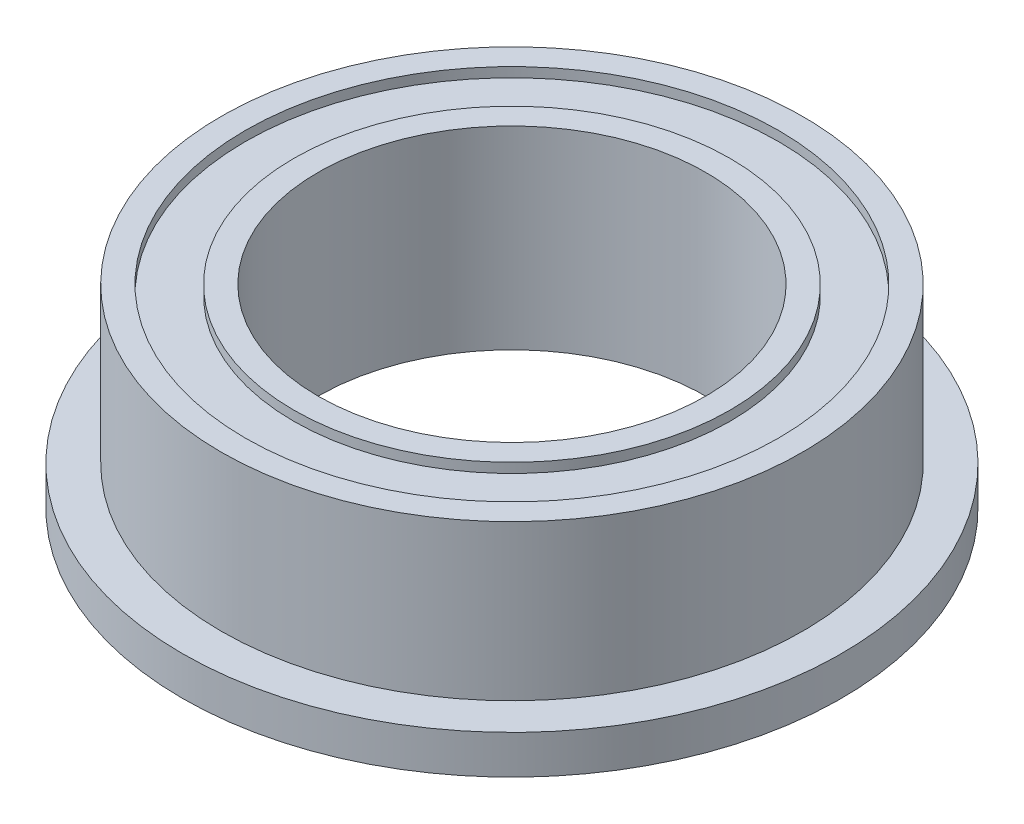
ISO-10303-21;
HEADER;
FILE_DESCRIPTION(('STEP AP214'),'2;1');
FILE_NAME('part.step','',(''),(''),'','','');
FILE_SCHEMA(('AUTOMOTIVE_DESIGN { 1 0 10303 214 1 1 1 1 }'));
ENDSEC;
DATA;
#1=APPLICATION_CONTEXT('core data for automotive mechanical design processes');
#2=APPLICATION_PROTOCOL_DEFINITION('international standard','automotive_design',2000,#1);
#3=PRODUCT_CONTEXT('',#1,'mechanical');
#4=PRODUCT('Part','Part','',(#3));
#5=PRODUCT_RELATED_PRODUCT_CATEGORY('part','',(#4));
#6=PRODUCT_DEFINITION_FORMATION('','',#4);
#7=PRODUCT_DEFINITION_CONTEXT('part definition',#1,'design');
#8=PRODUCT_DEFINITION('design','',#6,#7);
#9=PRODUCT_DEFINITION_SHAPE('','',#8);
#10=(LENGTH_UNIT() NAMED_UNIT(*) SI_UNIT(.MILLI.,.METRE.));
#11=(NAMED_UNIT(*) PLANE_ANGLE_UNIT() SI_UNIT($,.RADIAN.));
#12=(NAMED_UNIT(*) SI_UNIT($,.STERADIAN.) SOLID_ANGLE_UNIT());
#13=UNCERTAINTY_MEASURE_WITH_UNIT(LENGTH_MEASURE(1.E-05),#10,'distance_accuracy_value','');
#14=(GEOMETRIC_REPRESENTATION_CONTEXT(3) GLOBAL_UNCERTAINTY_ASSIGNED_CONTEXT((#13)) GLOBAL_UNIT_ASSIGNED_CONTEXT((#10,
#11,#12)) REPRESENTATION_CONTEXT('',''));
#15=CARTESIAN_POINT('',(0.,0.,0.));
#16=DIRECTION('',(0.,0.,1.));
#17=DIRECTION('',(1.,0.,0.));
#18=AXIS2_PLACEMENT_3D('',#15,#16,#17);
#19=CARTESIAN_POINT('',(0.,0.,0.));
#20=DIRECTION('',(0.,1.,0.));
#21=DIRECTION('',(0.,0.,1.));
#22=AXIS2_PLACEMENT_3D('',#19,#20,#21);
#23=PLANE('',#22);
#24=CARTESIAN_POINT('',(0.,0.,0.));
#25=DIRECTION('',(0.,1.,0.));
#26=DIRECTION('',(0.,0.,1.));
#27=AXIS2_PLACEMENT_3D('',#24,#25,#26);
#28=CIRCLE('',#27,4.);
#29=CARTESIAN_POINT('',(0.,0.,4.));
#30=VERTEX_POINT('',#29);
#31=EDGE_CURVE('E52',#30,#30,#28,.T.);
#32=ORIENTED_EDGE('',*,*,#31,.T.);
#33=EDGE_LOOP('',(#32));
#34=FACE_BOUND('',#33,.T.);
#35=CARTESIAN_POINT('',(0.,0.,0.));
#36=DIRECTION('',(0.,1.,0.));
#37=DIRECTION('',(0.,0.,1.));
#38=AXIS2_PLACEMENT_3D('',#35,#36,#37);
#39=CIRCLE('',#38,4.5);
#40=CARTESIAN_POINT('',(0.,0.,4.5));
#41=VERTEX_POINT('',#40);
#42=EDGE_CURVE('E86',#41,#41,#39,.T.);
#43=ORIENTED_EDGE('',*,*,#42,.F.);
#44=EDGE_LOOP('',(#43));
#45=FACE_BOUND('',#44,.T.);
#46=ADVANCED_FACE('F41',(#34,#45),#23,.F.);
#47=CARTESIAN_POINT('',(0.,4.,0.));
#48=DIRECTION('',(0.,1.,0.));
#49=DIRECTION('',(0.,0.,1.));
#50=AXIS2_PLACEMENT_3D('',#47,#48,#49);
#51=PLANE('',#50);
#52=CARTESIAN_POINT('',(0.,4.,0.));
#53=DIRECTION('',(0.,1.,0.));
#54=DIRECTION('',(0.,0.,1.));
#55=AXIS2_PLACEMENT_3D('',#52,#53,#54);
#56=CIRCLE('',#55,4.);
#57=CARTESIAN_POINT('',(0.,4.,4.));
#58=VERTEX_POINT('',#57);
#59=EDGE_CURVE('E48',#58,#58,#56,.T.);
#60=ORIENTED_EDGE('',*,*,#59,.F.);
#61=EDGE_LOOP('',(#60));
#62=FACE_BOUND('',#61,.T.);
#63=CARTESIAN_POINT('',(0.,4.,0.));
#64=DIRECTION('',(0.,1.,0.));
#65=DIRECTION('',(0.,0.,1.));
#66=AXIS2_PLACEMENT_3D('',#63,#64,#65);
#67=CIRCLE('',#66,4.5);
#68=CARTESIAN_POINT('',(0.,4.,4.5));
#69=VERTEX_POINT('',#68);
#70=EDGE_CURVE('E74',#69,#69,#67,.T.);
#71=ORIENTED_EDGE('',*,*,#70,.T.);
#72=EDGE_LOOP('',(#71));
#73=FACE_BOUND('',#72,.T.);
#74=ADVANCED_FACE('F102',(#62,#73),#51,.T.);
#75=CARTESIAN_POINT('',(0.,4.,0.));
#76=DIRECTION('',(0.,1.,0.));
#77=DIRECTION('',(0.,0.,1.));
#78=AXIS2_PLACEMENT_3D('',#75,#76,#77);
#79=CIRCLE('',#78,5.5);
#80=CARTESIAN_POINT('',(0.,4.,5.5));
#81=VERTEX_POINT('',#80);
#82=EDGE_CURVE('E68',#81,#81,#79,.T.);
#83=ORIENTED_EDGE('',*,*,#82,.F.);
#84=EDGE_LOOP('',(#83));
#85=FACE_BOUND('',#84,.T.);
#86=CARTESIAN_POINT('',(0.,4.,0.));
#87=DIRECTION('',(0.,1.,0.));
#88=DIRECTION('',(0.,0.,1.));
#89=AXIS2_PLACEMENT_3D('',#86,#87,#88);
#90=CIRCLE('',#89,6.);
#91=CARTESIAN_POINT('',(0.,4.,6.));
#92=VERTEX_POINT('',#91);
#93=EDGE_CURVE('E10',#92,#92,#90,.T.);
#94=ORIENTED_EDGE('',*,*,#93,.T.);
#95=EDGE_LOOP('',(#94));
#96=FACE_BOUND('',#95,.T.);
#97=ADVANCED_FACE('F110',(#85,#96),#51,.T.);
#98=CARTESIAN_POINT('',(0.,0.,0.));
#99=DIRECTION('',(0.,1.,0.));
#100=DIRECTION('',(0.,0.,1.));
#101=AXIS2_PLACEMENT_3D('',#98,#99,#100);
#102=CIRCLE('',#101,5.5);
#103=CARTESIAN_POINT('',(0.,0.,5.5));
#104=VERTEX_POINT('',#103);
#105=EDGE_CURVE('E80',#104,#104,#102,.T.);
#106=ORIENTED_EDGE('',*,*,#105,.T.);
#107=EDGE_LOOP('',(#106));
#108=FACE_BOUND('',#107,.T.);
#109=CARTESIAN_POINT('',(0.,0.,0.));
#110=DIRECTION('',(0.,1.,0.));
#111=DIRECTION('',(0.,0.,1.));
#112=AXIS2_PLACEMENT_3D('',#109,#110,#111);
#113=CIRCLE('',#112,6.8);
#114=CARTESIAN_POINT('',(0.,0.,6.8));
#115=VERTEX_POINT('',#114);
#116=EDGE_CURVE('E59',#115,#115,#113,.T.);
#117=ORIENTED_EDGE('',*,*,#116,.F.);
#118=EDGE_LOOP('',(#117));
#119=FACE_BOUND('',#118,.T.);
#120=ADVANCED_FACE('F104',(#108,#119),#23,.F.);
#121=CARTESIAN_POINT('',(0.,4.,0.));
#122=DIRECTION('',(0.,-1.,0.));
#123=DIRECTION('',(0.,0.,-1.));
#124=AXIS2_PLACEMENT_3D('',#121,#122,#123);
#125=CYLINDRICAL_SURFACE('',#124,6.);
#126=CARTESIAN_POINT('',(0.,0.8,0.));
#127=DIRECTION('',(0.,1.,0.));
#128=DIRECTION('',(0.,0.,1.));
#129=AXIS2_PLACEMENT_3D('',#126,#127,#128);
#130=CIRCLE('',#129,6.);
#131=CARTESIAN_POINT('',(0.,0.8,6.));
#132=VERTEX_POINT('',#131);
#133=EDGE_CURVE('E62',#132,#132,#130,.T.);
#134=ORIENTED_EDGE('',*,*,#133,.T.);
#135=EDGE_LOOP('',(#134));
#136=FACE_BOUND('',#135,.T.);
#137=ORIENTED_EDGE('',*,*,#93,.F.);
#138=EDGE_LOOP('',(#137));
#139=FACE_BOUND('',#138,.T.);
#140=ADVANCED_FACE('F43',(#136,#139),#125,.T.);
#141=CARTESIAN_POINT('',(0.,4.,0.));
#142=DIRECTION('',(0.,-1.,0.));
#143=DIRECTION('',(0.,0.,-1.));
#144=AXIS2_PLACEMENT_3D('',#141,#142,#143);
#145=CYLINDRICAL_SURFACE('',#144,4.);
#146=ORIENTED_EDGE('',*,*,#59,.T.);
#147=EDGE_LOOP('',(#146));
#148=FACE_BOUND('',#147,.T.);
#149=ORIENTED_EDGE('',*,*,#31,.F.);
#150=EDGE_LOOP('',(#149));
#151=FACE_BOUND('',#150,.T.);
#152=ADVANCED_FACE('F118',(#148,#151),#145,.F.);
#153=CARTESIAN_POINT('',(0.,0.8,0.));
#154=DIRECTION('',(0.,1.,0.));
#155=DIRECTION('',(0.,0.,1.));
#156=AXIS2_PLACEMENT_3D('',#153,#154,#155);
#157=PLANE('',#156);
#158=CARTESIAN_POINT('',(0.,0.8,0.));
#159=DIRECTION('',(0.,1.,0.));
#160=DIRECTION('',(0.,0.,1.));
#161=AXIS2_PLACEMENT_3D('',#158,#159,#160);
#162=CIRCLE('',#161,6.8);
#163=CARTESIAN_POINT('',(0.,0.8,6.8));
#164=VERTEX_POINT('',#163);
#165=EDGE_CURVE('E57',#164,#164,#162,.T.);
#166=ORIENTED_EDGE('',*,*,#165,.T.);
#167=EDGE_LOOP('',(#166));
#168=FACE_BOUND('',#167,.T.);
#169=ORIENTED_EDGE('',*,*,#133,.F.);
#170=EDGE_LOOP('',(#169));
#171=FACE_BOUND('',#170,.T.);
#172=ADVANCED_FACE('F129',(#168,#171),#157,.T.);
#173=CARTESIAN_POINT('',(0.,0.8,0.));
#174=DIRECTION('',(0.,-1.,0.));
#175=DIRECTION('',(0.,0.,-1.));
#176=AXIS2_PLACEMENT_3D('',#173,#174,#175);
#177=CYLINDRICAL_SURFACE('',#176,6.8);
#178=ORIENTED_EDGE('',*,*,#165,.F.);
#179=EDGE_LOOP('',(#178));
#180=FACE_BOUND('',#179,.T.);
#181=ORIENTED_EDGE('',*,*,#116,.T.);
#182=EDGE_LOOP('',(#181));
#183=FACE_BOUND('',#182,.T.);
#184=ADVANCED_FACE('F126',(#180,#183),#177,.T.);
#185=CARTESIAN_POINT('',(0.,3.8,0.));
#186=DIRECTION('',(0.,1.,0.));
#187=DIRECTION('',(0.,0.,1.));
#188=AXIS2_PLACEMENT_3D('',#185,#186,#187);
#189=CYLINDRICAL_SURFACE('',#188,5.5);
#190=CARTESIAN_POINT('',(0.,3.8,0.));
#191=DIRECTION('',(0.,1.,0.));
#192=DIRECTION('',(0.,0.,1.));
#193=AXIS2_PLACEMENT_3D('',#190,#191,#192);
#194=CIRCLE('',#193,5.5);
#195=CARTESIAN_POINT('',(0.,3.8,5.5));
#196=VERTEX_POINT('',#195);
#197=EDGE_CURVE('E67',#196,#196,#194,.T.);
#198=ORIENTED_EDGE('',*,*,#197,.F.);
#199=EDGE_LOOP('',(#198));
#200=FACE_BOUND('',#199,.T.);
#201=ORIENTED_EDGE('',*,*,#82,.T.);
#202=EDGE_LOOP('',(#201));
#203=FACE_BOUND('',#202,.T.);
#204=ADVANCED_FACE('F128',(#200,#203),#189,.F.);
#205=CARTESIAN_POINT('',(0.,3.8,0.));
#206=DIRECTION('',(0.,1.,0.));
#207=DIRECTION('',(0.,0.,1.));
#208=AXIS2_PLACEMENT_3D('',#205,#206,#207);
#209=PLANE('',#208);
#210=CARTESIAN_POINT('',(0.,3.8,0.));
#211=DIRECTION('',(0.,1.,0.));
#212=DIRECTION('',(0.,0.,1.));
#213=AXIS2_PLACEMENT_3D('',#210,#211,#212);
#214=CIRCLE('',#213,4.5);
#215=CARTESIAN_POINT('',(0.,3.8,4.5));
#216=VERTEX_POINT('',#215);
#217=EDGE_CURVE('E71',#216,#216,#214,.T.);
#218=ORIENTED_EDGE('',*,*,#217,.F.);
#219=EDGE_LOOP('',(#218));
#220=FACE_BOUND('',#219,.T.);
#221=ORIENTED_EDGE('',*,*,#197,.T.);
#222=EDGE_LOOP('',(#221));
#223=FACE_BOUND('',#222,.T.);
#224=ADVANCED_FACE('F136',(#220,#223),#209,.T.);
#225=CARTESIAN_POINT('',(0.,3.8,0.));
#226=DIRECTION('',(0.,1.,0.));
#227=DIRECTION('',(0.,0.,1.));
#228=AXIS2_PLACEMENT_3D('',#225,#226,#227);
#229=CYLINDRICAL_SURFACE('',#228,4.5);
#230=ORIENTED_EDGE('',*,*,#217,.T.);
#231=EDGE_LOOP('',(#230));
#232=FACE_BOUND('',#231,.T.);
#233=ORIENTED_EDGE('',*,*,#70,.F.);
#234=EDGE_LOOP('',(#233));
#235=FACE_BOUND('',#234,.T.);
#236=ADVANCED_FACE('F176',(#232,#235),#229,.T.);
#237=CARTESIAN_POINT('',(0.,0.2,0.));
#238=DIRECTION('',(0.,-1.,0.));
#239=DIRECTION('',(0.,0.,1.));
#240=AXIS2_PLACEMENT_3D('',#237,#238,#239);
#241=PLANE('',#240);
#242=CARTESIAN_POINT('',(0.,0.2,0.));
#243=DIRECTION('',(0.,1.,0.));
#244=DIRECTION('',(0.,0.,1.));
#245=AXIS2_PLACEMENT_3D('',#242,#243,#244);
#246=CIRCLE('',#245,5.5);
#247=CARTESIAN_POINT('',(0.,0.2,5.5));
#248=VERTEX_POINT('',#247);
#249=EDGE_CURVE('E77',#248,#248,#246,.T.);
#250=ORIENTED_EDGE('',*,*,#249,.F.);
#251=EDGE_LOOP('',(#250));
#252=FACE_BOUND('',#251,.T.);
#253=CARTESIAN_POINT('',(0.,0.2,0.));
#254=DIRECTION('',(0.,1.,0.));
#255=DIRECTION('',(0.,0.,1.));
#256=AXIS2_PLACEMENT_3D('',#253,#254,#255);
#257=CIRCLE('',#256,4.5);
#258=CARTESIAN_POINT('',(0.,0.2,4.5));
#259=VERTEX_POINT('',#258);
#260=EDGE_CURVE('E83',#259,#259,#257,.T.);
#261=ORIENTED_EDGE('',*,*,#260,.T.);
#262=EDGE_LOOP('',(#261));
#263=FACE_BOUND('',#262,.T.);
#264=ADVANCED_FACE('F92',(#252,#263),#241,.T.);
#265=CARTESIAN_POINT('',(0.,0.2,0.));
#266=DIRECTION('',(0.,-1.,0.));
#267=DIRECTION('',(0.,0.,-1.));
#268=AXIS2_PLACEMENT_3D('',#265,#266,#267);
#269=CYLINDRICAL_SURFACE('',#268,5.5);
#270=ORIENTED_EDGE('',*,*,#249,.T.);
#271=EDGE_LOOP('',(#270));
#272=FACE_BOUND('',#271,.T.);
#273=ORIENTED_EDGE('',*,*,#105,.F.);
#274=EDGE_LOOP('',(#273));
#275=FACE_BOUND('',#274,.T.);
#276=ADVANCED_FACE('F97',(#272,#275),#269,.F.);
#277=CARTESIAN_POINT('',(0.,0.2,0.));
#278=DIRECTION('',(0.,-1.,0.));
#279=DIRECTION('',(0.,0.,-1.));
#280=AXIS2_PLACEMENT_3D('',#277,#278,#279);
#281=CYLINDRICAL_SURFACE('',#280,4.5);
#282=ORIENTED_EDGE('',*,*,#260,.F.);
#283=EDGE_LOOP('',(#282));
#284=FACE_BOUND('',#283,.T.);
#285=ORIENTED_EDGE('',*,*,#42,.T.);
#286=EDGE_LOOP('',(#285));
#287=FACE_BOUND('',#286,.T.);
#288=ADVANCED_FACE('F94',(#284,#287),#281,.T.);
#289=CLOSED_SHELL('',(#46,#74,#97,#120,#140,#152,#172,#184,#204,#224,#236,#264,#276,#288));
#290=MANIFOLD_SOLID_BREP('B2',#289);
#291=ADVANCED_BREP_SHAPE_REPRESENTATION('',(#18,#290),#14);
#292=SHAPE_DEFINITION_REPRESENTATION(#9,#291);
ENDSEC;
END-ISO-10303-21;
